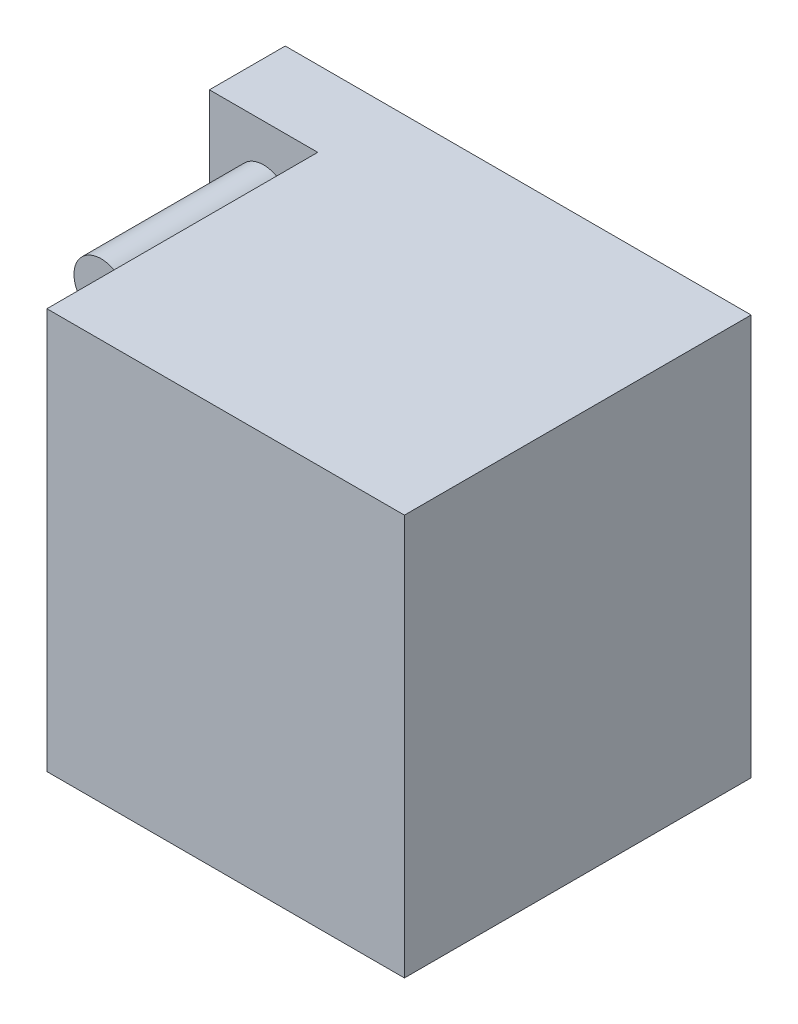
ISO-10303-21;
HEADER;
FILE_DESCRIPTION(('STEP AP214'),'2;1');
FILE_NAME('part.step','',(''),(''),'','','');
FILE_SCHEMA(('AUTOMOTIVE_DESIGN { 1 0 10303 214 1 1 1 1 }'));
ENDSEC;
DATA;
#1=APPLICATION_CONTEXT('core data for automotive mechanical design processes');
#2=APPLICATION_PROTOCOL_DEFINITION('international standard','automotive_design',2000,#1);
#3=PRODUCT_CONTEXT('',#1,'mechanical');
#4=PRODUCT('Part','Part','',(#3));
#5=PRODUCT_RELATED_PRODUCT_CATEGORY('part','',(#4));
#6=PRODUCT_DEFINITION_FORMATION('','',#4);
#7=PRODUCT_DEFINITION_CONTEXT('part definition',#1,'design');
#8=PRODUCT_DEFINITION('design','',#6,#7);
#9=PRODUCT_DEFINITION_SHAPE('','',#8);
#10=(LENGTH_UNIT() NAMED_UNIT(*) SI_UNIT(.MILLI.,.METRE.));
#11=(NAMED_UNIT(*) PLANE_ANGLE_UNIT() SI_UNIT($,.RADIAN.));
#12=(NAMED_UNIT(*) SI_UNIT($,.STERADIAN.) SOLID_ANGLE_UNIT());
#13=UNCERTAINTY_MEASURE_WITH_UNIT(LENGTH_MEASURE(1.E-05),#10,'distance_accuracy_value','');
#14=(GEOMETRIC_REPRESENTATION_CONTEXT(3) GLOBAL_UNCERTAINTY_ASSIGNED_CONTEXT((#13)) GLOBAL_UNIT_ASSIGNED_CONTEXT((#10,
#11,#12)) REPRESENTATION_CONTEXT('',''));
#15=CARTESIAN_POINT('',(0.,0.,0.));
#16=DIRECTION('',(0.,0.,1.));
#17=DIRECTION('',(1.,0.,0.));
#18=AXIS2_PLACEMENT_3D('',#15,#16,#17);
#19=CARTESIAN_POINT('',(0.,0.,32.));
#20=DIRECTION('',(1.,0.,0.));
#21=DIRECTION('',(0.,1.,0.));
#22=AXIS2_PLACEMENT_3D('',#19,#20,#21);
#23=PLANE('',#22);
#24=DIRECTION('',(0.,-1.,0.));
#25=VECTOR('',#24,1.);
#26=CARTESIAN_POINT('',(0.,0.,7.));
#27=LINE('',#26,#25);
#28=CARTESIAN_POINT('',(0.,0.,7.));
#29=VERTEX_POINT('',#28);
#30=CARTESIAN_POINT('',(0.,-37.,7.));
#31=VERTEX_POINT('',#30);
#32=EDGE_CURVE('E80',#29,#31,#27,.T.);
#33=ORIENTED_EDGE('',*,*,#32,.F.);
#34=DIRECTION('',(0.,0.,-1.));
#35=VECTOR('',#34,1.);
#36=CARTESIAN_POINT('',(0.,0.,32.));
#37=LINE('',#36,#35);
#38=CARTESIAN_POINT('',(0.,0.,0.));
#39=VERTEX_POINT('',#38);
#40=EDGE_CURVE('E74',#29,#39,#37,.T.);
#41=ORIENTED_EDGE('',*,*,#40,.T.);
#42=DIRECTION('',(0.,-1.,0.));
#43=VECTOR('',#42,1.);
#44=CARTESIAN_POINT('',(0.,0.,0.));
#45=LINE('',#44,#43);
#46=CARTESIAN_POINT('',(0.,-37.,0.));
#47=VERTEX_POINT('',#46);
#48=EDGE_CURVE('E78',#39,#47,#45,.T.);
#49=ORIENTED_EDGE('',*,*,#48,.T.);
#50=DIRECTION('',(0.,0.,-1.));
#51=VECTOR('',#50,1.);
#52=CARTESIAN_POINT('',(0.,-37.,32.));
#53=LINE('',#52,#51);
#54=EDGE_CURVE('E11',#31,#47,#53,.T.);
#55=ORIENTED_EDGE('',*,*,#54,.F.);
#56=EDGE_LOOP('',(#33,#41,#49,#55));
#57=FACE_BOUND('',#56,.T.);
#58=ADVANCED_FACE('F32',(#57),#23,.F.);
#59=CARTESIAN_POINT('',(0.,-37.,32.));
#60=DIRECTION('',(0.,1.,0.));
#61=DIRECTION('',(0.,0.,1.));
#62=AXIS2_PLACEMENT_3D('',#59,#60,#61);
#63=PLANE('',#62);
#64=DIRECTION('',(1.,0.,0.));
#65=VECTOR('',#64,1.);
#66=CARTESIAN_POINT('',(0.,-37.,32.));
#67=LINE('',#66,#65);
#68=CARTESIAN_POINT('',(10.,-37.,32.));
#69=VERTEX_POINT('',#68);
#70=CARTESIAN_POINT('',(43.,-37.,32.));
#71=VERTEX_POINT('',#70);
#72=EDGE_CURVE('E93',#69,#71,#67,.T.);
#73=ORIENTED_EDGE('',*,*,#72,.F.);
#74=DIRECTION('',(0.,0.,1.));
#75=VECTOR('',#74,1.);
#76=CARTESIAN_POINT('',(10.,-37.,7.));
#77=LINE('',#76,#75);
#78=CARTESIAN_POINT('',(10.,-37.,7.));
#79=VERTEX_POINT('',#78);
#80=EDGE_CURVE('E46',#79,#69,#77,.T.);
#81=ORIENTED_EDGE('',*,*,#80,.F.);
#82=DIRECTION('',(1.,0.,0.));
#83=VECTOR('',#82,1.);
#84=CARTESIAN_POINT('',(0.,-37.,7.));
#85=LINE('',#84,#83);
#86=EDGE_CURVE('E118',#31,#79,#85,.T.);
#87=ORIENTED_EDGE('',*,*,#86,.F.);
#88=ORIENTED_EDGE('',*,*,#54,.T.);
#89=DIRECTION('',(1.,0.,0.));
#90=VECTOR('',#89,1.);
#91=CARTESIAN_POINT('',(0.,-37.,0.));
#92=LINE('',#91,#90);
#93=CARTESIAN_POINT('',(43.,-37.,0.));
#94=VERTEX_POINT('',#93);
#95=EDGE_CURVE('E98',#47,#94,#92,.T.);
#96=ORIENTED_EDGE('',*,*,#95,.T.);
#97=DIRECTION('',(0.,0.,-1.));
#98=VECTOR('',#97,1.);
#99=CARTESIAN_POINT('',(43.,-37.,32.));
#100=LINE('',#99,#98);
#101=EDGE_CURVE('E39',#71,#94,#100,.T.);
#102=ORIENTED_EDGE('',*,*,#101,.F.);
#103=EDGE_LOOP('',(#73,#81,#87,#88,#96,#102));
#104=FACE_BOUND('',#103,.T.);
#105=ADVANCED_FACE('F114',(#104),#63,.F.);
#106=CARTESIAN_POINT('',(43.,0.,32.));
#107=DIRECTION('',(-1.,0.,0.));
#108=DIRECTION('',(0.,-1.,0.));
#109=AXIS2_PLACEMENT_3D('',#106,#107,#108);
#110=PLANE('',#109);
#111=DIRECTION('',(0.,1.,0.));
#112=VECTOR('',#111,1.);
#113=CARTESIAN_POINT('',(43.,0.,0.));
#114=LINE('',#113,#112);
#115=CARTESIAN_POINT('',(43.,0.,0.));
#116=VERTEX_POINT('',#115);
#117=EDGE_CURVE('E94',#94,#116,#114,.T.);
#118=ORIENTED_EDGE('',*,*,#117,.T.);
#119=DIRECTION('',(0.,0.,-1.));
#120=VECTOR('',#119,1.);
#121=CARTESIAN_POINT('',(43.,0.,32.));
#122=LINE('',#121,#120);
#123=CARTESIAN_POINT('',(43.,0.,32.));
#124=VERTEX_POINT('',#123);
#125=EDGE_CURVE('E83',#124,#116,#122,.T.);
#126=ORIENTED_EDGE('',*,*,#125,.F.);
#127=DIRECTION('',(0.,1.,0.));
#128=VECTOR('',#127,1.);
#129=CARTESIAN_POINT('',(43.,0.,32.));
#130=LINE('',#129,#128);
#131=EDGE_CURVE('E55',#71,#124,#130,.T.);
#132=ORIENTED_EDGE('',*,*,#131,.F.);
#133=ORIENTED_EDGE('',*,*,#101,.T.);
#134=EDGE_LOOP('',(#118,#126,#132,#133));
#135=FACE_BOUND('',#134,.T.);
#136=ADVANCED_FACE('F111',(#135),#110,.F.);
#137=CARTESIAN_POINT('',(0.,0.,32.));
#138=DIRECTION('',(0.,-1.,0.));
#139=DIRECTION('',(0.,0.,-1.));
#140=AXIS2_PLACEMENT_3D('',#137,#138,#139);
#141=PLANE('',#140);
#142=DIRECTION('',(-1.,0.,0.));
#143=VECTOR('',#142,1.);
#144=CARTESIAN_POINT('',(0.,0.,7.));
#145=LINE('',#144,#143);
#146=CARTESIAN_POINT('',(10.,0.,7.));
#147=VERTEX_POINT('',#146);
#148=EDGE_CURVE('E130',#147,#29,#145,.T.);
#149=ORIENTED_EDGE('',*,*,#148,.F.);
#150=DIRECTION('',(0.,0.,1.));
#151=VECTOR('',#150,1.);
#152=CARTESIAN_POINT('',(10.,0.,7.));
#153=LINE('',#152,#151);
#154=CARTESIAN_POINT('',(10.,0.,32.));
#155=VERTEX_POINT('',#154);
#156=EDGE_CURVE('E99',#147,#155,#153,.T.);
#157=ORIENTED_EDGE('',*,*,#156,.T.);
#158=DIRECTION('',(-1.,0.,0.));
#159=VECTOR('',#158,1.);
#160=CARTESIAN_POINT('',(0.,0.,32.));
#161=LINE('',#160,#159);
#162=EDGE_CURVE('E84',#124,#155,#161,.T.);
#163=ORIENTED_EDGE('',*,*,#162,.F.);
#164=ORIENTED_EDGE('',*,*,#125,.T.);
#165=DIRECTION('',(-1.,0.,0.));
#166=VECTOR('',#165,1.);
#167=CARTESIAN_POINT('',(0.,0.,0.));
#168=LINE('',#167,#166);
#169=EDGE_CURVE('E88',#116,#39,#168,.T.);
#170=ORIENTED_EDGE('',*,*,#169,.T.);
#171=ORIENTED_EDGE('',*,*,#40,.F.);
#172=EDGE_LOOP('',(#149,#157,#163,#164,#170,#171));
#173=FACE_BOUND('',#172,.T.);
#174=ADVANCED_FACE('F89',(#173),#141,.F.);
#175=CARTESIAN_POINT('',(0.,0.,32.));
#176=DIRECTION('',(0.,0.,1.));
#177=DIRECTION('',(1.,0.,0.));
#178=AXIS2_PLACEMENT_3D('',#175,#176,#177);
#179=PLANE('',#178);
#180=DIRECTION('',(0.,1.,0.));
#181=VECTOR('',#180,1.);
#182=CARTESIAN_POINT('',(10.,0.,32.));
#183=LINE('',#182,#181);
#184=EDGE_CURVE('E138',#69,#155,#183,.T.);
#185=ORIENTED_EDGE('',*,*,#184,.F.);
#186=ORIENTED_EDGE('',*,*,#72,.T.);
#187=ORIENTED_EDGE('',*,*,#131,.T.);
#188=ORIENTED_EDGE('',*,*,#162,.T.);
#189=EDGE_LOOP('',(#185,#186,#187,#188));
#190=FACE_BOUND('',#189,.T.);
#191=ADVANCED_FACE('F141',(#190),#179,.T.);
#192=CARTESIAN_POINT('',(0.,0.,0.));
#193=DIRECTION('',(0.,0.,1.));
#194=DIRECTION('',(1.,0.,0.));
#195=AXIS2_PLACEMENT_3D('',#192,#193,#194);
#196=PLANE('',#195);
#197=ORIENTED_EDGE('',*,*,#48,.F.);
#198=ORIENTED_EDGE('',*,*,#169,.F.);
#199=ORIENTED_EDGE('',*,*,#117,.F.);
#200=ORIENTED_EDGE('',*,*,#95,.F.);
#201=EDGE_LOOP('',(#197,#198,#199,#200));
#202=FACE_BOUND('',#201,.T.);
#203=ADVANCED_FACE('F97',(#202),#196,.F.);
#204=CARTESIAN_POINT('',(10.,0.,7.));
#205=DIRECTION('',(1.,0.,0.));
#206=DIRECTION('',(0.,1.,0.));
#207=AXIS2_PLACEMENT_3D('',#204,#205,#206);
#208=PLANE('',#207);
#209=ORIENTED_EDGE('',*,*,#184,.T.);
#210=ORIENTED_EDGE('',*,*,#156,.F.);
#211=DIRECTION('',(0.,1.,0.));
#212=VECTOR('',#211,1.);
#213=CARTESIAN_POINT('',(10.,0.,7.));
#214=LINE('',#213,#212);
#215=EDGE_CURVE('E132',#79,#147,#214,.T.);
#216=ORIENTED_EDGE('',*,*,#215,.F.);
#217=ORIENTED_EDGE('',*,*,#80,.T.);
#218=EDGE_LOOP('',(#209,#210,#216,#217));
#219=FACE_BOUND('',#218,.T.);
#220=ADVANCED_FACE('F142',(#219),#208,.F.);
#221=CARTESIAN_POINT('',(0.,0.,7.));
#222=DIRECTION('',(0.,0.,1.));
#223=DIRECTION('',(1.,0.,0.));
#224=AXIS2_PLACEMENT_3D('',#221,#222,#223);
#225=PLANE('',#224);
#226=CARTESIAN_POINT('',(5.00000000000025,-30.,7.));
#227=DIRECTION('',(0.,0.,1.));
#228=DIRECTION('',(1.,0.,0.));
#229=AXIS2_PLACEMENT_3D('',#226,#227,#228);
#230=CIRCLE('',#229,2.5);
#231=CARTESIAN_POINT('',(7.50000000000025,-30.,7.));
#232=VERTEX_POINT('',#231);
#233=EDGE_CURVE('E163',#232,#232,#230,.T.);
#234=ORIENTED_EDGE('',*,*,#233,.F.);
#235=EDGE_LOOP('',(#234));
#236=FACE_BOUND('',#235,.T.);
#237=CARTESIAN_POINT('',(5.00000000000017,-22.,7.));
#238=DIRECTION('',(0.,0.,1.));
#239=DIRECTION('',(1.,0.,0.));
#240=AXIS2_PLACEMENT_3D('',#237,#238,#239);
#241=CIRCLE('',#240,2.5);
#242=CARTESIAN_POINT('',(7.50000000000017,-22.,7.));
#243=VERTEX_POINT('',#242);
#244=EDGE_CURVE('E157',#243,#243,#241,.T.);
#245=ORIENTED_EDGE('',*,*,#244,.F.);
#246=EDGE_LOOP('',(#245));
#247=FACE_BOUND('',#246,.T.);
#248=CARTESIAN_POINT('',(5.00000000000008,-14.,7.));
#249=DIRECTION('',(0.,0.,1.));
#250=DIRECTION('',(1.,0.,0.));
#251=AXIS2_PLACEMENT_3D('',#248,#249,#250);
#252=CIRCLE('',#251,2.5);
#253=CARTESIAN_POINT('',(7.50000000000008,-14.,7.));
#254=VERTEX_POINT('',#253);
#255=EDGE_CURVE('E151',#254,#254,#252,.T.);
#256=ORIENTED_EDGE('',*,*,#255,.F.);
#257=EDGE_LOOP('',(#256));
#258=FACE_BOUND('',#257,.T.);
#259=CARTESIAN_POINT('',(5.,-6.,7.));
#260=DIRECTION('',(0.,0.,1.));
#261=DIRECTION('',(1.,0.,0.));
#262=AXIS2_PLACEMENT_3D('',#259,#260,#261);
#263=CIRCLE('',#262,2.5);
#264=CARTESIAN_POINT('',(7.5,-6.,7.));
#265=VERTEX_POINT('',#264);
#266=EDGE_CURVE('E145',#265,#265,#263,.T.);
#267=ORIENTED_EDGE('',*,*,#266,.F.);
#268=EDGE_LOOP('',(#267));
#269=FACE_BOUND('',#268,.T.);
#270=ORIENTED_EDGE('',*,*,#32,.T.);
#271=ORIENTED_EDGE('',*,*,#86,.T.);
#272=ORIENTED_EDGE('',*,*,#215,.T.);
#273=ORIENTED_EDGE('',*,*,#148,.T.);
#274=EDGE_LOOP('',(#270,#271,#272,#273));
#275=FACE_BOUND('',#274,.T.);
#276=ADVANCED_FACE('F131',(#236,#247,#258,#269,#275),#225,.T.);
#277=CARTESIAN_POINT('',(5.,-6.,22.));
#278=DIRECTION('',(0.,0.,-1.));
#279=DIRECTION('',(-1.,0.,0.));
#280=AXIS2_PLACEMENT_3D('',#277,#278,#279);
#281=CYLINDRICAL_SURFACE('',#280,2.5);
#282=CARTESIAN_POINT('',(5.,-6.,22.));
#283=DIRECTION('',(0.,0.,1.));
#284=DIRECTION('',(1.,0.,0.));
#285=AXIS2_PLACEMENT_3D('',#282,#283,#284);
#286=CIRCLE('',#285,2.5);
#287=CARTESIAN_POINT('',(7.5,-6.,22.));
#288=VERTEX_POINT('',#287);
#289=EDGE_CURVE('E139',#288,#288,#286,.T.);
#290=ORIENTED_EDGE('',*,*,#289,.F.);
#291=EDGE_LOOP('',(#290));
#292=FACE_BOUND('',#291,.T.);
#293=ORIENTED_EDGE('',*,*,#266,.T.);
#294=EDGE_LOOP('',(#293));
#295=FACE_BOUND('',#294,.T.);
#296=ADVANCED_FACE('F180',(#292,#295),#281,.T.);
#297=CARTESIAN_POINT('',(5.,-6.,22.));
#298=DIRECTION('',(0.,0.,1.));
#299=DIRECTION('',(1.,0.,0.));
#300=AXIS2_PLACEMENT_3D('',#297,#298,#299);
#301=PLANE('',#300);
#302=ORIENTED_EDGE('',*,*,#289,.T.);
#303=EDGE_LOOP('',(#302));
#304=FACE_BOUND('',#303,.T.);
#305=ADVANCED_FACE('F189',(#304),#301,.T.);
#306=CARTESIAN_POINT('',(5.00000000000008,-14.,22.));
#307=DIRECTION('',(0.,0.,-1.));
#308=DIRECTION('',(-1.,0.,0.));
#309=AXIS2_PLACEMENT_3D('',#306,#307,#308);
#310=CYLINDRICAL_SURFACE('',#309,2.5);
#311=CARTESIAN_POINT('',(5.00000000000008,-14.,22.));
#312=DIRECTION('',(0.,0.,1.));
#313=DIRECTION('',(1.,0.,0.));
#314=AXIS2_PLACEMENT_3D('',#311,#312,#313);
#315=CIRCLE('',#314,2.5);
#316=CARTESIAN_POINT('',(7.50000000000008,-14.,22.));
#317=VERTEX_POINT('',#316);
#318=EDGE_CURVE('E148',#317,#317,#315,.T.);
#319=ORIENTED_EDGE('',*,*,#318,.F.);
#320=EDGE_LOOP('',(#319));
#321=FACE_BOUND('',#320,.T.);
#322=ORIENTED_EDGE('',*,*,#255,.T.);
#323=EDGE_LOOP('',(#322));
#324=FACE_BOUND('',#323,.T.);
#325=ADVANCED_FACE('F195',(#321,#324),#310,.T.);
#326=CARTESIAN_POINT('',(5.00000000000008,-14.,22.));
#327=DIRECTION('',(0.,0.,1.));
#328=DIRECTION('',(1.,0.,0.));
#329=AXIS2_PLACEMENT_3D('',#326,#327,#328);
#330=PLANE('',#329);
#331=ORIENTED_EDGE('',*,*,#318,.T.);
#332=EDGE_LOOP('',(#331));
#333=FACE_BOUND('',#332,.T.);
#334=ADVANCED_FACE('F243',(#333),#330,.T.);
#335=CARTESIAN_POINT('',(5.00000000000017,-22.,22.));
#336=DIRECTION('',(0.,0.,-1.));
#337=DIRECTION('',(-1.,0.,0.));
#338=AXIS2_PLACEMENT_3D('',#335,#336,#337);
#339=CYLINDRICAL_SURFACE('',#338,2.5);
#340=CARTESIAN_POINT('',(5.00000000000017,-22.,22.));
#341=DIRECTION('',(0.,0.,1.));
#342=DIRECTION('',(1.,0.,0.));
#343=AXIS2_PLACEMENT_3D('',#340,#341,#342);
#344=CIRCLE('',#343,2.5);
#345=CARTESIAN_POINT('',(7.50000000000017,-22.,22.));
#346=VERTEX_POINT('',#345);
#347=EDGE_CURVE('E154',#346,#346,#344,.T.);
#348=ORIENTED_EDGE('',*,*,#347,.F.);
#349=EDGE_LOOP('',(#348));
#350=FACE_BOUND('',#349,.T.);
#351=ORIENTED_EDGE('',*,*,#244,.T.);
#352=EDGE_LOOP('',(#351));
#353=FACE_BOUND('',#352,.T.);
#354=ADVANCED_FACE('F253',(#350,#353),#339,.T.);
#355=CARTESIAN_POINT('',(5.00000000000017,-22.,22.));
#356=DIRECTION('',(0.,0.,1.));
#357=DIRECTION('',(1.,0.,0.));
#358=AXIS2_PLACEMENT_3D('',#355,#356,#357);
#359=PLANE('',#358);
#360=ORIENTED_EDGE('',*,*,#347,.T.);
#361=EDGE_LOOP('',(#360));
#362=FACE_BOUND('',#361,.T.);
#363=ADVANCED_FACE('F174',(#362),#359,.T.);
#364=CARTESIAN_POINT('',(5.00000000000025,-30.,22.));
#365=DIRECTION('',(0.,0.,-1.));
#366=DIRECTION('',(-1.,0.,0.));
#367=AXIS2_PLACEMENT_3D('',#364,#365,#366);
#368=CYLINDRICAL_SURFACE('',#367,2.5);
#369=CARTESIAN_POINT('',(5.00000000000025,-30.,22.));
#370=DIRECTION('',(0.,0.,1.));
#371=DIRECTION('',(1.,0.,0.));
#372=AXIS2_PLACEMENT_3D('',#369,#370,#371);
#373=CIRCLE('',#372,2.5);
#374=CARTESIAN_POINT('',(7.50000000000025,-30.,22.));
#375=VERTEX_POINT('',#374);
#376=EDGE_CURVE('E160',#375,#375,#373,.T.);
#377=ORIENTED_EDGE('',*,*,#376,.F.);
#378=EDGE_LOOP('',(#377));
#379=FACE_BOUND('',#378,.T.);
#380=ORIENTED_EDGE('',*,*,#233,.T.);
#381=EDGE_LOOP('',(#380));
#382=FACE_BOUND('',#381,.T.);
#383=ADVANCED_FACE('F171',(#379,#382),#368,.T.);
#384=CARTESIAN_POINT('',(5.00000000000025,-30.,22.));
#385=DIRECTION('',(0.,0.,1.));
#386=DIRECTION('',(1.,0.,0.));
#387=AXIS2_PLACEMENT_3D('',#384,#385,#386);
#388=PLANE('',#387);
#389=ORIENTED_EDGE('',*,*,#376,.T.);
#390=EDGE_LOOP('',(#389));
#391=FACE_BOUND('',#390,.T.);
#392=ADVANCED_FACE('F169',(#391),#388,.T.);
#393=CLOSED_SHELL('',(#58,#105,#136,#174,#191,#203,#220,#276,#296,#305,#325,#334,#354,#363,#383,#392));
#394=MANIFOLD_SOLID_BREP('B2',#393);
#395=ADVANCED_BREP_SHAPE_REPRESENTATION('',(#18,#394),#14);
#396=SHAPE_DEFINITION_REPRESENTATION(#9,#395);
ENDSEC;
END-ISO-10303-21;
